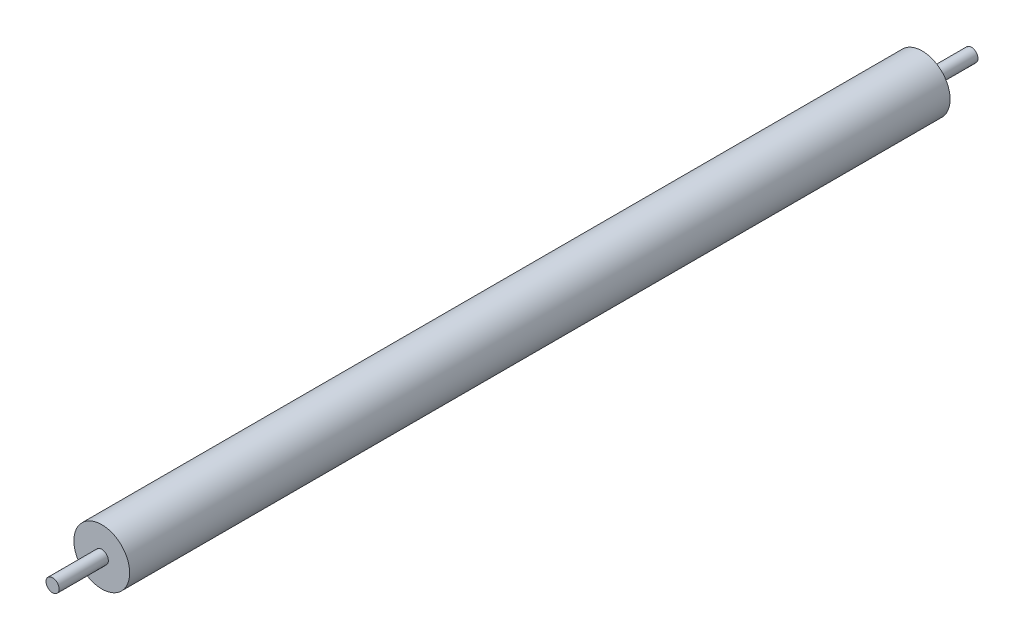
ISO-10303-21;
HEADER;
FILE_DESCRIPTION(('STEP AP214'),'2;1');
FILE_NAME('part.step','',(''),(''),'','','');
FILE_SCHEMA(('AUTOMOTIVE_DESIGN { 1 0 10303 214 1 1 1 1 }'));
ENDSEC;
DATA;
#1=APPLICATION_CONTEXT('core data for automotive mechanical design processes');
#2=APPLICATION_PROTOCOL_DEFINITION('international standard','automotive_design',2000,#1);
#3=PRODUCT_CONTEXT('',#1,'mechanical');
#4=PRODUCT('Part','Part','',(#3));
#5=PRODUCT_RELATED_PRODUCT_CATEGORY('part','',(#4));
#6=PRODUCT_DEFINITION_FORMATION('','',#4);
#7=PRODUCT_DEFINITION_CONTEXT('part definition',#1,'design');
#8=PRODUCT_DEFINITION('design','',#6,#7);
#9=PRODUCT_DEFINITION_SHAPE('','',#8);
#10=(LENGTH_UNIT() NAMED_UNIT(*) SI_UNIT(.MILLI.,.METRE.));
#11=(NAMED_UNIT(*) PLANE_ANGLE_UNIT() SI_UNIT($,.RADIAN.));
#12=(NAMED_UNIT(*) SI_UNIT($,.STERADIAN.) SOLID_ANGLE_UNIT());
#13=UNCERTAINTY_MEASURE_WITH_UNIT(LENGTH_MEASURE(1.E-05),#10,'distance_accuracy_value','');
#14=(GEOMETRIC_REPRESENTATION_CONTEXT(3) GLOBAL_UNCERTAINTY_ASSIGNED_CONTEXT((#13)) GLOBAL_UNIT_ASSIGNED_CONTEXT((#10,
#11,#12)) REPRESENTATION_CONTEXT('',''));
#15=CARTESIAN_POINT('',(0.,0.,0.));
#16=DIRECTION('',(0.,0.,1.));
#17=DIRECTION('',(1.,0.,0.));
#18=AXIS2_PLACEMENT_3D('',#15,#16,#17);
#19=CARTESIAN_POINT('',(0.,0.,560.));
#20=DIRECTION('',(0.,0.,-1.));
#21=DIRECTION('',(-1.,0.,0.));
#22=AXIS2_PLACEMENT_3D('',#19,#20,#21);
#23=CYLINDRICAL_SURFACE('',#22,4.);
#24=CARTESIAN_POINT('',(0.,0.,530.));
#25=DIRECTION('',(0.,0.,1.));
#26=DIRECTION('',(1.,0.,0.));
#27=AXIS2_PLACEMENT_3D('',#24,#25,#26);
#28=CIRCLE('',#27,4.);
#29=CARTESIAN_POINT('',(4.,0.,530.));
#30=VERTEX_POINT('',#29);
#31=EDGE_CURVE('E41',#30,#30,#28,.T.);
#32=ORIENTED_EDGE('',*,*,#31,.T.);
#33=EDGE_LOOP('',(#32));
#34=FACE_BOUND('',#33,.T.);
#35=CARTESIAN_POINT('',(0.,0.,560.));
#36=DIRECTION('',(0.,0.,1.));
#37=DIRECTION('',(1.,0.,0.));
#38=AXIS2_PLACEMENT_3D('',#35,#36,#37);
#39=CIRCLE('',#38,4.);
#40=CARTESIAN_POINT('',(4.,0.,560.));
#41=VERTEX_POINT('',#40);
#42=EDGE_CURVE('E46',#41,#41,#39,.T.);
#43=ORIENTED_EDGE('',*,*,#42,.F.);
#44=EDGE_LOOP('',(#43));
#45=FACE_BOUND('',#44,.T.);
#46=ADVANCED_FACE('F38',(#34,#45),#23,.T.);
#47=CARTESIAN_POINT('',(0.,0.,560.));
#48=DIRECTION('',(0.,0.,1.));
#49=DIRECTION('',(1.,0.,0.));
#50=AXIS2_PLACEMENT_3D('',#47,#48,#49);
#51=PLANE('',#50);
#52=ORIENTED_EDGE('',*,*,#42,.T.);
#53=EDGE_LOOP('',(#52));
#54=FACE_BOUND('',#53,.T.);
#55=ADVANCED_FACE('F86',(#54),#51,.T.);
#56=CARTESIAN_POINT('',(0.,0.,530.));
#57=DIRECTION('',(0.,0.,-1.));
#58=DIRECTION('',(-1.,0.,0.));
#59=AXIS2_PLACEMENT_3D('',#56,#57,#58);
#60=CYLINDRICAL_SURFACE('',#59,17.);
#61=CARTESIAN_POINT('',(0.,0.,530.));
#62=DIRECTION('',(0.,0.,1.));
#63=DIRECTION('',(1.,0.,0.));
#64=AXIS2_PLACEMENT_3D('',#61,#62,#63);
#65=CIRCLE('',#64,17.);
#66=CARTESIAN_POINT('',(17.,0.,530.));
#67=VERTEX_POINT('',#66);
#68=EDGE_CURVE('E62',#67,#67,#65,.T.);
#69=ORIENTED_EDGE('',*,*,#68,.F.);
#70=EDGE_LOOP('',(#69));
#71=FACE_BOUND('',#70,.T.);
#72=CARTESIAN_POINT('',(0.,0.,30.));
#73=DIRECTION('',(0.,0.,1.));
#74=DIRECTION('',(1.,0.,0.));
#75=AXIS2_PLACEMENT_3D('',#72,#73,#74);
#76=CIRCLE('',#75,17.);
#77=CARTESIAN_POINT('',(17.,0.,30.));
#78=VERTEX_POINT('',#77);
#79=EDGE_CURVE('E58',#78,#78,#76,.T.);
#80=ORIENTED_EDGE('',*,*,#79,.T.);
#81=EDGE_LOOP('',(#80));
#82=FACE_BOUND('',#81,.T.);
#83=ADVANCED_FACE('F78',(#71,#82),#60,.T.);
#84=CARTESIAN_POINT('',(0.,0.,530.));
#85=DIRECTION('',(0.,0.,1.));
#86=DIRECTION('',(1.,0.,0.));
#87=AXIS2_PLACEMENT_3D('',#84,#85,#86);
#88=PLANE('',#87);
#89=ORIENTED_EDGE('',*,*,#31,.F.);
#90=EDGE_LOOP('',(#89));
#91=FACE_BOUND('',#90,.T.);
#92=ORIENTED_EDGE('',*,*,#68,.T.);
#93=EDGE_LOOP('',(#92));
#94=FACE_BOUND('',#93,.T.);
#95=ADVANCED_FACE('F75',(#91,#94),#88,.T.);
#96=CARTESIAN_POINT('',(0.,0.,30.));
#97=DIRECTION('',(0.,0.,1.));
#98=DIRECTION('',(1.,0.,0.));
#99=AXIS2_PLACEMENT_3D('',#96,#97,#98);
#100=PLANE('',#99);
#101=CARTESIAN_POINT('',(0.,0.,30.));
#102=DIRECTION('',(0.,0.,1.));
#103=DIRECTION('',(1.,0.,0.));
#104=AXIS2_PLACEMENT_3D('',#101,#102,#103);
#105=CIRCLE('',#104,4.);
#106=CARTESIAN_POINT('',(4.,0.,30.));
#107=VERTEX_POINT('',#106);
#108=EDGE_CURVE('E10',#107,#107,#105,.T.);
#109=ORIENTED_EDGE('',*,*,#108,.T.);
#110=EDGE_LOOP('',(#109));
#111=FACE_BOUND('',#110,.T.);
#112=ORIENTED_EDGE('',*,*,#79,.F.);
#113=EDGE_LOOP('',(#112));
#114=FACE_BOUND('',#113,.T.);
#115=ADVANCED_FACE('F77',(#111,#114),#100,.F.);
#116=CARTESIAN_POINT('',(0.,0.,0.));
#117=DIRECTION('',(0.,0.,1.));
#118=DIRECTION('',(1.,0.,0.));
#119=AXIS2_PLACEMENT_3D('',#116,#117,#118);
#120=PLANE('',#119);
#121=CARTESIAN_POINT('',(0.,0.,0.));
#122=DIRECTION('',(0.,0.,1.));
#123=DIRECTION('',(1.,0.,0.));
#124=AXIS2_PLACEMENT_3D('',#121,#122,#123);
#125=CIRCLE('',#124,4.);
#126=CARTESIAN_POINT('',(4.,0.,0.));
#127=VERTEX_POINT('',#126);
#128=EDGE_CURVE('E52',#127,#127,#125,.T.);
#129=ORIENTED_EDGE('',*,*,#128,.F.);
#130=EDGE_LOOP('',(#129));
#131=FACE_BOUND('',#130,.T.);
#132=ADVANCED_FACE('F84',(#131),#120,.F.);
#133=ORIENTED_EDGE('',*,*,#128,.T.);
#134=EDGE_LOOP('',(#133));
#135=FACE_BOUND('',#134,.T.);
#136=ORIENTED_EDGE('',*,*,#108,.F.);
#137=EDGE_LOOP('',(#136));
#138=FACE_BOUND('',#137,.T.);
#139=ADVANCED_FACE('F90',(#135,#138),#23,.T.);
#140=CLOSED_SHELL('',(#46,#55,#83,#95,#115,#132,#139));
#141=MANIFOLD_SOLID_BREP('B2',#140);
#142=ADVANCED_BREP_SHAPE_REPRESENTATION('',(#18,#141),#14);
#143=SHAPE_DEFINITION_REPRESENTATION(#9,#142);
ENDSEC;
END-ISO-10303-21;
